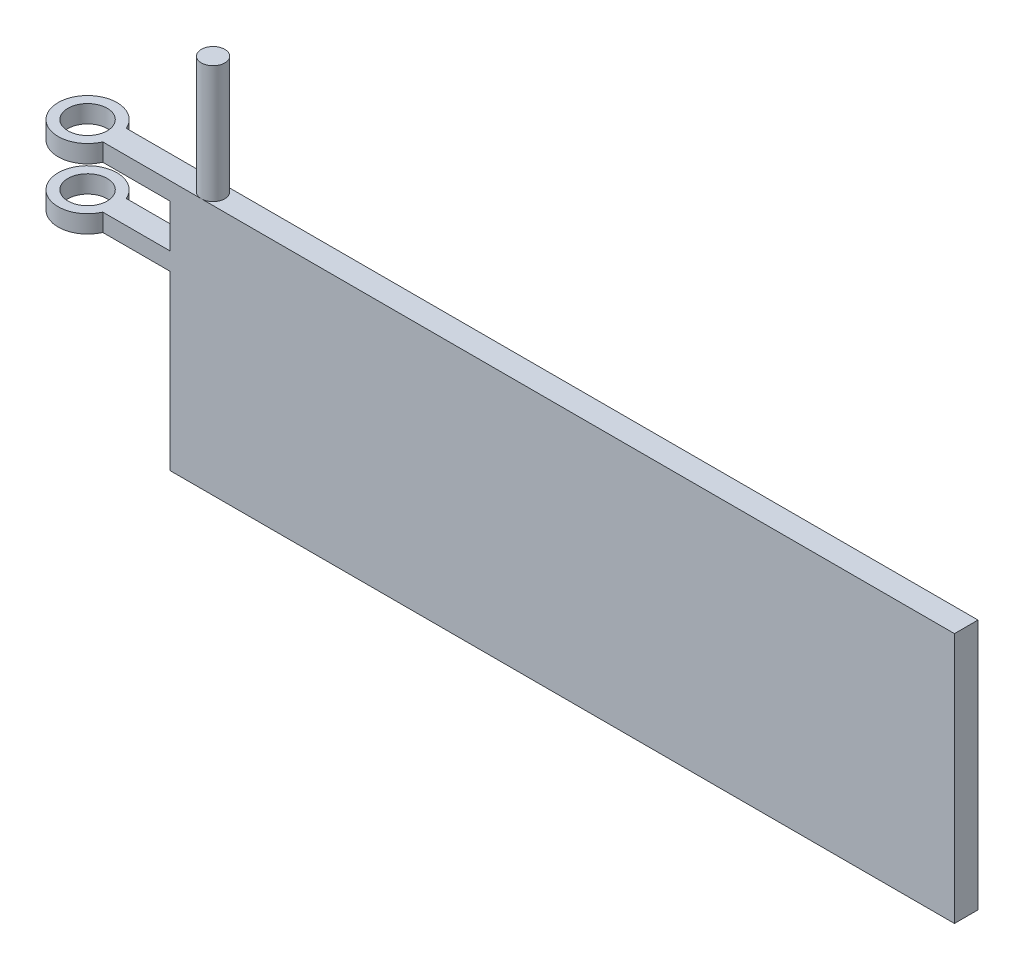
ISO-10303-21;
HEADER;
FILE_DESCRIPTION(('STEP AP214'),'2;1');
FILE_NAME('part.step','',(''),(''),'','','');
FILE_SCHEMA(('AUTOMOTIVE_DESIGN { 1 0 10303 214 1 1 1 1 }'));
ENDSEC;
DATA;
#1=APPLICATION_CONTEXT('core data for automotive mechanical design processes');
#2=APPLICATION_PROTOCOL_DEFINITION('international standard','automotive_design',2000,#1);
#3=PRODUCT_CONTEXT('',#1,'mechanical');
#4=PRODUCT('Part','Part','',(#3));
#5=PRODUCT_RELATED_PRODUCT_CATEGORY('part','',(#4));
#6=PRODUCT_DEFINITION_FORMATION('','',#4);
#7=PRODUCT_DEFINITION_CONTEXT('part definition',#1,'design');
#8=PRODUCT_DEFINITION('design','',#6,#7);
#9=PRODUCT_DEFINITION_SHAPE('','',#8);
#10=(LENGTH_UNIT() NAMED_UNIT(*) SI_UNIT(.MILLI.,.METRE.));
#11=(NAMED_UNIT(*) PLANE_ANGLE_UNIT() SI_UNIT($,.RADIAN.));
#12=(NAMED_UNIT(*) SI_UNIT($,.STERADIAN.) SOLID_ANGLE_UNIT());
#13=UNCERTAINTY_MEASURE_WITH_UNIT(LENGTH_MEASURE(1.E-05),#10,'distance_accuracy_value','');
#14=(GEOMETRIC_REPRESENTATION_CONTEXT(3) GLOBAL_UNCERTAINTY_ASSIGNED_CONTEXT((#13)) GLOBAL_UNIT_ASSIGNED_CONTEXT((#10,
#11,#12)) REPRESENTATION_CONTEXT('',''));
#15=CARTESIAN_POINT('',(0.,0.,0.));
#16=DIRECTION('',(0.,0.,1.));
#17=DIRECTION('',(1.,0.,0.));
#18=AXIS2_PLACEMENT_3D('',#15,#16,#17);
#19=CARTESIAN_POINT('',(-62.,32.,0.));
#20=DIRECTION('',(0.,-1.,0.));
#21=DIRECTION('',(0.,0.,-1.));
#22=AXIS2_PLACEMENT_3D('',#19,#20,#21);
#23=CYLINDRICAL_SURFACE('',#22,3.75000000000001);
#24=CARTESIAN_POINT('',(-62.,29.75,0.));
#25=DIRECTION('',(0.,1.,0.));
#26=DIRECTION('',(0.,0.,1.));
#27=AXIS2_PLACEMENT_3D('',#24,#25,#26);
#28=CIRCLE('',#27,3.75000000000001);
#29=CARTESIAN_POINT('',(-58.5630682287831,29.75,-1.5));
#30=VERTEX_POINT('',#29);
#31=CARTESIAN_POINT('',(-58.5630682287831,29.75,1.5));
#32=VERTEX_POINT('',#31);
#33=EDGE_CURVE('E114',#30,#32,#28,.T.);
#34=ORIENTED_EDGE('',*,*,#33,.T.);
#35=DIRECTION('',(0.,-1.,0.));
#36=VECTOR('',#35,1.);
#37=CARTESIAN_POINT('',(-58.5630682287831,32.,1.5));
#38=LINE('',#37,#36);
#39=CARTESIAN_POINT('',(-58.5630682287831,32.,1.5));
#40=VERTEX_POINT('',#39);
#41=EDGE_CURVE('E171',#40,#32,#38,.T.);
#42=ORIENTED_EDGE('',*,*,#41,.F.);
#43=CARTESIAN_POINT('',(-62.,32.,0.));
#44=DIRECTION('',(0.,1.,0.));
#45=DIRECTION('',(0.,0.,1.));
#46=AXIS2_PLACEMENT_3D('',#43,#44,#45);
#47=CIRCLE('',#46,3.75000000000001);
#48=CARTESIAN_POINT('',(-58.5630682287831,32.,-1.5));
#49=VERTEX_POINT('',#48);
#50=EDGE_CURVE('E159',#49,#40,#47,.T.);
#51=ORIENTED_EDGE('',*,*,#50,.F.);
#52=DIRECTION('',(0.,-1.,0.));
#53=VECTOR('',#52,1.);
#54=CARTESIAN_POINT('',(-58.5630682287831,32.,-1.5));
#55=LINE('',#54,#53);
#56=EDGE_CURVE('E174',#49,#30,#55,.T.);
#57=ORIENTED_EDGE('',*,*,#56,.T.);
#58=EDGE_LOOP('',(#34,#42,#51,#57));
#59=FACE_BOUND('',#58,.T.);
#60=ADVANCED_FACE('F33',(#59),#23,.T.);
#61=CARTESIAN_POINT('',(-58.5630682287831,24.25,1.5));
#62=VERTEX_POINT('',#61);
#63=CARTESIAN_POINT('',(-58.5630682287831,22.,1.5));
#64=VERTEX_POINT('',#63);
#65=EDGE_CURVE('E165',#62,#64,#38,.T.);
#66=ORIENTED_EDGE('',*,*,#65,.F.);
#67=CARTESIAN_POINT('',(-62.,24.25,0.));
#68=DIRECTION('',(0.,-1.,0.));
#69=DIRECTION('',(0.,0.,-1.));
#70=AXIS2_PLACEMENT_3D('',#67,#68,#69);
#71=CIRCLE('',#70,3.75000000000001);
#72=CARTESIAN_POINT('',(-58.5630682287831,24.25,-1.5));
#73=VERTEX_POINT('',#72);
#74=EDGE_CURVE('E110',#62,#73,#71,.T.);
#75=ORIENTED_EDGE('',*,*,#74,.T.);
#76=CARTESIAN_POINT('',(-58.5630682287831,22.,-1.5));
#77=VERTEX_POINT('',#76);
#78=EDGE_CURVE('E173',#73,#77,#55,.T.);
#79=ORIENTED_EDGE('',*,*,#78,.T.);
#80=CARTESIAN_POINT('',(-62.,22.,0.));
#81=DIRECTION('',(0.,1.,0.));
#82=DIRECTION('',(0.,0.,1.));
#83=AXIS2_PLACEMENT_3D('',#80,#81,#82);
#84=CIRCLE('',#83,3.75000000000001);
#85=EDGE_CURVE('E167',#77,#64,#84,.T.);
#86=ORIENTED_EDGE('',*,*,#85,.T.);
#87=EDGE_LOOP('',(#66,#75,#79,#86));
#88=FACE_BOUND('',#87,.T.);
#89=ADVANCED_FACE('F236',(#88),#23,.T.);
#90=CARTESIAN_POINT('',(-62.,32.,0.));
#91=DIRECTION('',(0.,-1.,0.));
#92=DIRECTION('',(0.,0.,-1.));
#93=AXIS2_PLACEMENT_3D('',#90,#91,#92);
#94=CYLINDRICAL_SURFACE('',#93,2.5);
#95=CARTESIAN_POINT('',(-62.,29.75,0.));
#96=DIRECTION('',(0.,1.,0.));
#97=DIRECTION('',(0.,0.,1.));
#98=AXIS2_PLACEMENT_3D('',#95,#96,#97);
#99=CIRCLE('',#98,2.5);
#100=CARTESIAN_POINT('',(-62.,29.75,2.5));
#101=VERTEX_POINT('',#100);
#102=EDGE_CURVE('E112',#101,#101,#99,.T.);
#103=ORIENTED_EDGE('',*,*,#102,.F.);
#104=EDGE_LOOP('',(#103));
#105=FACE_BOUND('',#104,.T.);
#106=CARTESIAN_POINT('',(-62.,32.,0.));
#107=DIRECTION('',(0.,1.,0.));
#108=DIRECTION('',(0.,0.,1.));
#109=AXIS2_PLACEMENT_3D('',#106,#107,#108);
#110=CIRCLE('',#109,2.5);
#111=CARTESIAN_POINT('',(-62.,32.,2.5));
#112=VERTEX_POINT('',#111);
#113=EDGE_CURVE('E146',#112,#112,#110,.T.);
#114=ORIENTED_EDGE('',*,*,#113,.T.);
#115=EDGE_LOOP('',(#114));
#116=FACE_BOUND('',#115,.T.);
#117=ADVANCED_FACE('F259',(#105,#116),#94,.F.);
#118=CARTESIAN_POINT('',(-62.,32.,0.));
#119=DIRECTION('',(0.,1.,0.));
#120=DIRECTION('',(0.,0.,1.));
#121=AXIS2_PLACEMENT_3D('',#118,#119,#120);
#122=PLANE('',#121);
#123=CARTESIAN_POINT('',(-46.,32.,0.));
#124=DIRECTION('',(0.,1.,0.));
#125=DIRECTION('',(0.,0.,1.));
#126=AXIS2_PLACEMENT_3D('',#123,#124,#125);
#127=CIRCLE('',#126,1.5);
#128=CARTESIAN_POINT('',(-46.,32.,1.5));
#129=VERTEX_POINT('',#128);
#130=CARTESIAN_POINT('',(-46.,32.,-1.5));
#131=VERTEX_POINT('',#130);
#132=EDGE_CURVE('E139',#129,#131,#127,.T.);
#133=ORIENTED_EDGE('',*,*,#132,.F.);
#134=DIRECTION('',(1.,0.,0.));
#135=VECTOR('',#134,1.);
#136=CARTESIAN_POINT('',(50.,32.,1.49999999999999));
#137=LINE('',#136,#135);
#138=CARTESIAN_POINT('',(50.,32.,1.49999999999999));
#139=VERTEX_POINT('',#138);
#140=EDGE_CURVE('E162',#129,#139,#137,.T.);
#141=ORIENTED_EDGE('',*,*,#140,.T.);
#142=DIRECTION('',(0.,0.,-1.));
#143=VECTOR('',#142,1.);
#144=CARTESIAN_POINT('',(50.,32.,-1.5));
#145=LINE('',#144,#143);
#146=CARTESIAN_POINT('',(50.,32.,-1.5));
#147=VERTEX_POINT('',#146);
#148=EDGE_CURVE('E152',#139,#147,#145,.T.);
#149=ORIENTED_EDGE('',*,*,#148,.T.);
#150=DIRECTION('',(-1.,0.,0.));
#151=VECTOR('',#150,1.);
#152=CARTESIAN_POINT('',(50.,32.,-1.5));
#153=LINE('',#152,#151);
#154=EDGE_CURVE('E156',#147,#131,#153,.T.);
#155=ORIENTED_EDGE('',*,*,#154,.T.);
#156=EDGE_LOOP('',(#133,#141,#149,#155));
#157=FACE_BOUND('',#156,.T.);
#158=ADVANCED_FACE('F251',(#157),#122,.T.);
#159=CARTESIAN_POINT('',(50.,22.,-1.5));
#160=DIRECTION('',(-1.,0.,0.));
#161=DIRECTION('',(0.,0.,1.));
#162=AXIS2_PLACEMENT_3D('',#159,#160,#161);
#163=PLANE('',#162);
#164=DIRECTION('',(0.,0.,-1.));
#165=VECTOR('',#164,1.);
#166=CARTESIAN_POINT('',(50.,0.,-1.5));
#167=LINE('',#166,#165);
#168=CARTESIAN_POINT('',(50.,0.,1.5));
#169=VERTEX_POINT('',#168);
#170=CARTESIAN_POINT('',(50.,0.,-1.5));
#171=VERTEX_POINT('',#170);
#172=EDGE_CURVE('E97',#169,#171,#167,.T.);
#173=ORIENTED_EDGE('',*,*,#172,.T.);
#174=DIRECTION('',(0.,-1.,0.));
#175=VECTOR('',#174,1.);
#176=CARTESIAN_POINT('',(50.,22.,-1.5));
#177=LINE('',#176,#175);
#178=EDGE_CURVE('E105',#147,#171,#177,.T.);
#179=ORIENTED_EDGE('',*,*,#178,.F.);
#180=ORIENTED_EDGE('',*,*,#148,.F.);
#181=DIRECTION('',(0.,-1.,0.));
#182=VECTOR('',#181,1.);
#183=CARTESIAN_POINT('',(50.,22.,1.5));
#184=LINE('',#183,#182);
#185=EDGE_CURVE('E92',#139,#169,#184,.T.);
#186=ORIENTED_EDGE('',*,*,#185,.T.);
#187=EDGE_LOOP('',(#173,#179,#180,#186));
#188=FACE_BOUND('',#187,.T.);
#189=ADVANCED_FACE('F35',(#188),#163,.F.);
#190=CARTESIAN_POINT('',(-50.,22.,-1.5));
#191=DIRECTION('',(0.,0.,1.));
#192=DIRECTION('',(1.,0.,0.));
#193=AXIS2_PLACEMENT_3D('',#190,#191,#192);
#194=PLANE('',#193);
#195=DIRECTION('',(0.,1.,0.));
#196=VECTOR('',#195,1.);
#197=CARTESIAN_POINT('',(-50.,22.,-1.5));
#198=LINE('',#197,#196);
#199=CARTESIAN_POINT('',(-50.,24.25,-1.5));
#200=VERTEX_POINT('',#199);
#201=CARTESIAN_POINT('',(-50.,29.75,-1.5));
#202=VERTEX_POINT('',#201);
#203=EDGE_CURVE('E137',#200,#202,#198,.T.);
#204=ORIENTED_EDGE('',*,*,#203,.T.);
#205=DIRECTION('',(-1.,0.,0.));
#206=VECTOR('',#205,1.);
#207=CARTESIAN_POINT('',(-50.,29.75,-1.5));
#208=LINE('',#207,#206);
#209=EDGE_CURVE('E134',#202,#30,#208,.T.);
#210=ORIENTED_EDGE('',*,*,#209,.T.);
#211=ORIENTED_EDGE('',*,*,#56,.F.);
#212=EDGE_CURVE('E155',#131,#49,#153,.T.);
#213=ORIENTED_EDGE('',*,*,#212,.F.);
#214=ORIENTED_EDGE('',*,*,#154,.F.);
#215=ORIENTED_EDGE('',*,*,#178,.T.);
#216=DIRECTION('',(-1.,0.,0.));
#217=VECTOR('',#216,1.);
#218=CARTESIAN_POINT('',(-50.,0.,-1.5));
#219=LINE('',#218,#217);
#220=CARTESIAN_POINT('',(-50.,0.,-1.5));
#221=VERTEX_POINT('',#220);
#222=EDGE_CURVE('E81',#171,#221,#219,.T.);
#223=ORIENTED_EDGE('',*,*,#222,.T.);
#224=DIRECTION('',(0.,-1.,0.));
#225=VECTOR('',#224,1.);
#226=CARTESIAN_POINT('',(-50.,22.,-1.5));
#227=LINE('',#226,#225);
#228=CARTESIAN_POINT('',(-50.,22.,-1.5));
#229=VERTEX_POINT('',#228);
#230=EDGE_CURVE('E56',#229,#221,#227,.T.);
#231=ORIENTED_EDGE('',*,*,#230,.F.);
#232=DIRECTION('',(-1.,0.,0.));
#233=VECTOR('',#232,1.);
#234=CARTESIAN_POINT('',(50.,22.,-1.5));
#235=LINE('',#234,#233);
#236=EDGE_CURVE('E149',#229,#77,#235,.T.);
#237=ORIENTED_EDGE('',*,*,#236,.T.);
#238=ORIENTED_EDGE('',*,*,#78,.F.);
#239=DIRECTION('',(1.,0.,0.));
#240=VECTOR('',#239,1.);
#241=CARTESIAN_POINT('',(-50.,24.25,-1.5));
#242=LINE('',#241,#240);
#243=EDGE_CURVE('E115',#73,#200,#242,.T.);
#244=ORIENTED_EDGE('',*,*,#243,.T.);
#245=EDGE_LOOP('',(#204,#210,#211,#213,#214,#215,#223,#231,#237,#238,#244));
#246=FACE_BOUND('',#245,.T.);
#247=ADVANCED_FACE('F177',(#246),#194,.F.);
#248=CARTESIAN_POINT('',(-50.,22.,-1.5));
#249=DIRECTION('',(1.,0.,0.));
#250=DIRECTION('',(0.,0.,-1.));
#251=AXIS2_PLACEMENT_3D('',#248,#249,#250);
#252=PLANE('',#251);
#253=DIRECTION('',(0.,0.,1.));
#254=VECTOR('',#253,1.);
#255=CARTESIAN_POINT('',(-50.,0.,-1.5));
#256=LINE('',#255,#254);
#257=CARTESIAN_POINT('',(-50.,0.,1.5));
#258=VERTEX_POINT('',#257);
#259=EDGE_CURVE('E73',#221,#258,#256,.T.);
#260=ORIENTED_EDGE('',*,*,#259,.T.);
#261=DIRECTION('',(0.,-1.,0.));
#262=VECTOR('',#261,1.);
#263=CARTESIAN_POINT('',(-50.,22.,1.5));
#264=LINE('',#263,#262);
#265=CARTESIAN_POINT('',(-50.,22.,1.5));
#266=VERTEX_POINT('',#265);
#267=EDGE_CURVE('E76',#266,#258,#264,.T.);
#268=ORIENTED_EDGE('',*,*,#267,.F.);
#269=DIRECTION('',(0.,0.,1.));
#270=VECTOR('',#269,1.);
#271=CARTESIAN_POINT('',(-50.,22.,-1.5));
#272=LINE('',#271,#270);
#273=EDGE_CURVE('E98',#229,#266,#272,.T.);
#274=ORIENTED_EDGE('',*,*,#273,.F.);
#275=ORIENTED_EDGE('',*,*,#230,.T.);
#276=EDGE_LOOP('',(#260,#268,#274,#275));
#277=FACE_BOUND('',#276,.T.);
#278=ADVANCED_FACE('F75',(#277),#252,.F.);
#279=CARTESIAN_POINT('',(-50.,22.,1.5));
#280=DIRECTION('',(0.,0.,-1.));
#281=DIRECTION('',(-1.,0.,0.));
#282=AXIS2_PLACEMENT_3D('',#279,#280,#281);
#283=PLANE('',#282);
#284=ORIENTED_EDGE('',*,*,#41,.T.);
#285=DIRECTION('',(1.,0.,0.));
#286=VECTOR('',#285,1.);
#287=CARTESIAN_POINT('',(-50.,29.75,1.5));
#288=LINE('',#287,#286);
#289=CARTESIAN_POINT('',(-50.,29.75,1.5));
#290=VERTEX_POINT('',#289);
#291=EDGE_CURVE('E119',#32,#290,#288,.T.);
#292=ORIENTED_EDGE('',*,*,#291,.T.);
#293=DIRECTION('',(0.,-1.,0.));
#294=VECTOR('',#293,1.);
#295=CARTESIAN_POINT('',(-50.,22.,1.5));
#296=LINE('',#295,#294);
#297=CARTESIAN_POINT('',(-50.,24.25,1.5));
#298=VERTEX_POINT('',#297);
#299=EDGE_CURVE('E11',#290,#298,#296,.T.);
#300=ORIENTED_EDGE('',*,*,#299,.T.);
#301=DIRECTION('',(-1.,0.,0.));
#302=VECTOR('',#301,1.);
#303=CARTESIAN_POINT('',(-50.,24.25,1.5));
#304=LINE('',#303,#302);
#305=EDGE_CURVE('E122',#298,#62,#304,.T.);
#306=ORIENTED_EDGE('',*,*,#305,.T.);
#307=ORIENTED_EDGE('',*,*,#65,.T.);
#308=DIRECTION('',(1.,0.,0.));
#309=VECTOR('',#308,1.);
#310=CARTESIAN_POINT('',(50.,22.,1.49999999999999));
#311=LINE('',#310,#309);
#312=EDGE_CURVE('E91',#64,#266,#311,.T.);
#313=ORIENTED_EDGE('',*,*,#312,.T.);
#314=ORIENTED_EDGE('',*,*,#267,.T.);
#315=DIRECTION('',(1.,0.,0.));
#316=VECTOR('',#315,1.);
#317=CARTESIAN_POINT('',(-50.,0.,1.5));
#318=LINE('',#317,#316);
#319=EDGE_CURVE('E80',#258,#169,#318,.T.);
#320=ORIENTED_EDGE('',*,*,#319,.T.);
#321=ORIENTED_EDGE('',*,*,#185,.F.);
#322=ORIENTED_EDGE('',*,*,#140,.F.);
#323=EDGE_CURVE('E163',#40,#129,#137,.T.);
#324=ORIENTED_EDGE('',*,*,#323,.F.);
#325=EDGE_LOOP('',(#284,#292,#300,#306,#307,#313,#314,#320,#321,#322,#324));
#326=FACE_BOUND('',#325,.T.);
#327=ADVANCED_FACE('F86',(#326),#283,.F.);
#328=CARTESIAN_POINT('',(0.,0.,0.));
#329=DIRECTION('',(0.,1.,0.));
#330=DIRECTION('',(0.,0.,1.));
#331=AXIS2_PLACEMENT_3D('',#328,#329,#330);
#332=PLANE('',#331);
#333=ORIENTED_EDGE('',*,*,#172,.F.);
#334=ORIENTED_EDGE('',*,*,#319,.F.);
#335=ORIENTED_EDGE('',*,*,#259,.F.);
#336=ORIENTED_EDGE('',*,*,#222,.F.);
#337=EDGE_LOOP('',(#333,#334,#335,#336));
#338=FACE_BOUND('',#337,.T.);
#339=ADVANCED_FACE('F95',(#338),#332,.F.);
#340=CARTESIAN_POINT('',(-62.,22.,0.));
#341=DIRECTION('',(0.,1.,0.));
#342=DIRECTION('',(0.,0.,1.));
#343=AXIS2_PLACEMENT_3D('',#340,#341,#342);
#344=PLANE('',#343);
#345=CARTESIAN_POINT('',(-62.,22.,0.));
#346=DIRECTION('',(0.,1.,0.));
#347=DIRECTION('',(0.,0.,1.));
#348=AXIS2_PLACEMENT_3D('',#345,#346,#347);
#349=CIRCLE('',#348,2.5);
#350=CARTESIAN_POINT('',(-62.,22.,2.5));
#351=VERTEX_POINT('',#350);
#352=EDGE_CURVE('E143',#351,#351,#349,.T.);
#353=ORIENTED_EDGE('',*,*,#352,.T.);
#354=EDGE_LOOP('',(#353));
#355=FACE_BOUND('',#354,.T.);
#356=ORIENTED_EDGE('',*,*,#236,.F.);
#357=ORIENTED_EDGE('',*,*,#273,.T.);
#358=ORIENTED_EDGE('',*,*,#312,.F.);
#359=ORIENTED_EDGE('',*,*,#85,.F.);
#360=EDGE_LOOP('',(#356,#357,#358,#359));
#361=FACE_BOUND('',#360,.T.);
#362=ADVANCED_FACE('F240',(#355,#361),#344,.F.);
#363=EDGE_CURVE('E41',#131,#129,#127,.T.);
#364=ORIENTED_EDGE('',*,*,#363,.F.);
#365=ORIENTED_EDGE('',*,*,#212,.T.);
#366=ORIENTED_EDGE('',*,*,#50,.T.);
#367=ORIENTED_EDGE('',*,*,#323,.T.);
#368=EDGE_LOOP('',(#364,#365,#366,#367));
#369=FACE_BOUND('',#368,.T.);
#370=ORIENTED_EDGE('',*,*,#113,.F.);
#371=EDGE_LOOP('',(#370));
#372=FACE_BOUND('',#371,.T.);
#373=ADVANCED_FACE('F242',(#369,#372),#122,.T.);
#374=CARTESIAN_POINT('',(-62.,24.25,0.));
#375=DIRECTION('',(0.,-1.,0.));
#376=DIRECTION('',(0.,0.,-1.));
#377=AXIS2_PLACEMENT_3D('',#374,#375,#376);
#378=CIRCLE('',#377,2.5);
#379=CARTESIAN_POINT('',(-62.,24.25,-2.5));
#380=VERTEX_POINT('',#379);
#381=EDGE_CURVE('E108',#380,#380,#378,.T.);
#382=ORIENTED_EDGE('',*,*,#381,.F.);
#383=EDGE_LOOP('',(#382));
#384=FACE_BOUND('',#383,.T.);
#385=ORIENTED_EDGE('',*,*,#352,.F.);
#386=EDGE_LOOP('',(#385));
#387=FACE_BOUND('',#386,.T.);
#388=ADVANCED_FACE('F249',(#384,#387),#94,.F.);
#389=CARTESIAN_POINT('',(-46.,47.,0.));
#390=DIRECTION('',(0.,-1.,0.));
#391=DIRECTION('',(0.,0.,-1.));
#392=AXIS2_PLACEMENT_3D('',#389,#390,#391);
#393=CYLINDRICAL_SURFACE('',#392,1.5);
#394=CARTESIAN_POINT('',(-46.,47.,0.));
#395=DIRECTION('',(0.,1.,0.));
#396=DIRECTION('',(0.,0.,1.));
#397=AXIS2_PLACEMENT_3D('',#394,#395,#396);
#398=CIRCLE('',#397,1.5);
#399=CARTESIAN_POINT('',(-46.,47.,1.5));
#400=VERTEX_POINT('',#399);
#401=EDGE_CURVE('E140',#400,#400,#398,.T.);
#402=ORIENTED_EDGE('',*,*,#401,.F.);
#403=EDGE_LOOP('',(#402));
#404=FACE_BOUND('',#403,.T.);
#405=ORIENTED_EDGE('',*,*,#132,.T.);
#406=ORIENTED_EDGE('',*,*,#363,.T.);
#407=EDGE_LOOP('',(#405,#406));
#408=FACE_BOUND('',#407,.T.);
#409=ADVANCED_FACE('F278',(#404,#408),#393,.T.);
#410=CARTESIAN_POINT('',(-46.,47.,0.));
#411=DIRECTION('',(0.,1.,0.));
#412=DIRECTION('',(0.,0.,1.));
#413=AXIS2_PLACEMENT_3D('',#410,#411,#412);
#414=PLANE('',#413);
#415=ORIENTED_EDGE('',*,*,#401,.T.);
#416=EDGE_LOOP('',(#415));
#417=FACE_BOUND('',#416,.T.);
#418=ADVANCED_FACE('F282',(#417),#414,.T.);
#419=CARTESIAN_POINT('',(-50.,29.75,-3.75));
#420=DIRECTION('',(1.,0.,0.));
#421=DIRECTION('',(0.,0.,-1.));
#422=AXIS2_PLACEMENT_3D('',#419,#420,#421);
#423=PLANE('',#422);
#424=DIRECTION('',(0.,0.,1.));
#425=VECTOR('',#424,1.);
#426=CARTESIAN_POINT('',(-50.,24.25,-3.75));
#427=LINE('',#426,#425);
#428=EDGE_CURVE('E228',#200,#298,#427,.T.);
#429=ORIENTED_EDGE('',*,*,#428,.T.);
#430=ORIENTED_EDGE('',*,*,#299,.F.);
#431=DIRECTION('',(0.,0.,1.));
#432=VECTOR('',#431,1.);
#433=CARTESIAN_POINT('',(-50.,29.75,-3.75));
#434=LINE('',#433,#432);
#435=EDGE_CURVE('E111',#202,#290,#434,.T.);
#436=ORIENTED_EDGE('',*,*,#435,.F.);
#437=ORIENTED_EDGE('',*,*,#203,.F.);
#438=EDGE_LOOP('',(#429,#430,#436,#437));
#439=FACE_BOUND('',#438,.T.);
#440=ADVANCED_FACE('F227',(#439),#423,.F.);
#441=CARTESIAN_POINT('',(-65.75,29.75,-3.75));
#442=DIRECTION('',(0.,1.,0.));
#443=DIRECTION('',(0.,0.,1.));
#444=AXIS2_PLACEMENT_3D('',#441,#442,#443);
#445=PLANE('',#444);
#446=ORIENTED_EDGE('',*,*,#102,.T.);
#447=EDGE_LOOP('',(#446));
#448=FACE_BOUND('',#447,.T.);
#449=ORIENTED_EDGE('',*,*,#435,.T.);
#450=ORIENTED_EDGE('',*,*,#291,.F.);
#451=ORIENTED_EDGE('',*,*,#33,.F.);
#452=ORIENTED_EDGE('',*,*,#209,.F.);
#453=EDGE_LOOP('',(#449,#450,#451,#452));
#454=FACE_BOUND('',#453,.T.);
#455=ADVANCED_FACE('F289',(#448,#454),#445,.F.);
#456=CARTESIAN_POINT('',(-65.75,24.25,-3.75));
#457=DIRECTION('',(0.,-1.,0.));
#458=DIRECTION('',(0.,0.,-1.));
#459=AXIS2_PLACEMENT_3D('',#456,#457,#458);
#460=PLANE('',#459);
#461=ORIENTED_EDGE('',*,*,#381,.T.);
#462=EDGE_LOOP('',(#461));
#463=FACE_BOUND('',#462,.T.);
#464=ORIENTED_EDGE('',*,*,#74,.F.);
#465=ORIENTED_EDGE('',*,*,#305,.F.);
#466=ORIENTED_EDGE('',*,*,#428,.F.);
#467=ORIENTED_EDGE('',*,*,#243,.F.);
#468=EDGE_LOOP('',(#464,#465,#466,#467));
#469=FACE_BOUND('',#468,.T.);
#470=ADVANCED_FACE('F231',(#463,#469),#460,.F.);
#471=CLOSED_SHELL('',(#60,#89,#117,#158,#189,#247,#278,#327,#339,#362,#373,#388,#409,#418,#440,
#455,#470));
#472=MANIFOLD_SOLID_BREP('B2',#471);
#473=ADVANCED_BREP_SHAPE_REPRESENTATION('',(#18,#472),#14);
#474=SHAPE_DEFINITION_REPRESENTATION(#9,#473);
ENDSEC;
END-ISO-10303-21;
